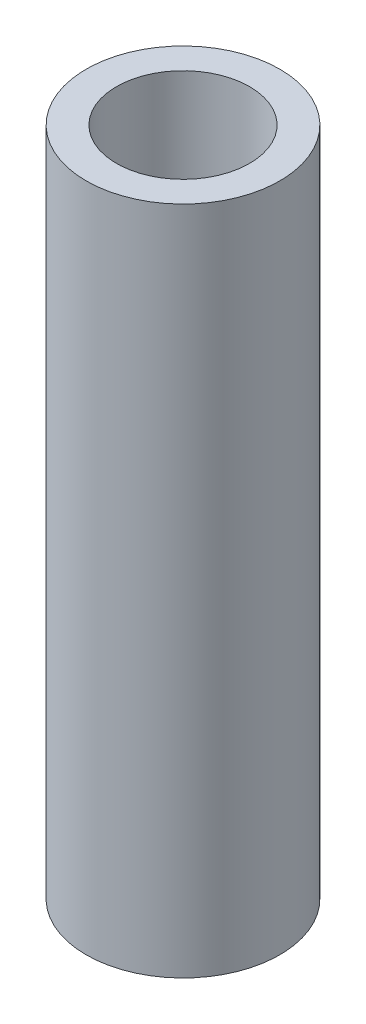
ISO-10303-21;
HEADER;
FILE_DESCRIPTION(('STEP AP214'),'2;1');
FILE_NAME('part.step','',(''),(''),'','','');
FILE_SCHEMA(('AUTOMOTIVE_DESIGN { 1 0 10303 214 1 1 1 1 }'));
ENDSEC;
DATA;
#1=APPLICATION_CONTEXT('core data for automotive mechanical design processes');
#2=APPLICATION_PROTOCOL_DEFINITION('international standard','automotive_design',2000,#1);
#3=PRODUCT_CONTEXT('',#1,'mechanical');
#4=PRODUCT('Part','Part','',(#3));
#5=PRODUCT_RELATED_PRODUCT_CATEGORY('part','',(#4));
#6=PRODUCT_DEFINITION_FORMATION('','',#4);
#7=PRODUCT_DEFINITION_CONTEXT('part definition',#1,'design');
#8=PRODUCT_DEFINITION('design','',#6,#7);
#9=PRODUCT_DEFINITION_SHAPE('','',#8);
#10=(LENGTH_UNIT() NAMED_UNIT(*) SI_UNIT(.MILLI.,.METRE.));
#11=(NAMED_UNIT(*) PLANE_ANGLE_UNIT() SI_UNIT($,.RADIAN.));
#12=(NAMED_UNIT(*) SI_UNIT($,.STERADIAN.) SOLID_ANGLE_UNIT());
#13=UNCERTAINTY_MEASURE_WITH_UNIT(LENGTH_MEASURE(1.E-05),#10,'distance_accuracy_value','');
#14=(GEOMETRIC_REPRESENTATION_CONTEXT(3) GLOBAL_UNCERTAINTY_ASSIGNED_CONTEXT((#13)) GLOBAL_UNIT_ASSIGNED_CONTEXT((#10,
#11,#12)) REPRESENTATION_CONTEXT('',''));
#15=CARTESIAN_POINT('',(0.,0.,0.));
#16=DIRECTION('',(0.,0.,1.));
#17=DIRECTION('',(1.,0.,0.));
#18=AXIS2_PLACEMENT_3D('',#15,#16,#17);
#19=CARTESIAN_POINT('',(0.,45.,0.));
#20=DIRECTION('',(0.,1.,0.));
#21=DIRECTION('',(0.,0.,1.));
#22=AXIS2_PLACEMENT_3D('',#19,#20,#21);
#23=PLANE('',#22);
#24=CARTESIAN_POINT('',(0.,45.,0.));
#25=DIRECTION('',(0.,1.,0.));
#26=DIRECTION('',(0.,0.,1.));
#27=AXIS2_PLACEMENT_3D('',#24,#25,#26);
#28=CIRCLE('',#27,6.5);
#29=CARTESIAN_POINT('',(0.,45.,-6.5));
#30=VERTEX_POINT('',#29);
#31=EDGE_CURVE('E10',#30,#30,#28,.T.);
#32=ORIENTED_EDGE('',*,*,#31,.T.);
#33=EDGE_LOOP('',(#32));
#34=FACE_BOUND('',#33,.T.);
#35=CARTESIAN_POINT('',(0.,45.,0.));
#36=DIRECTION('',(0.,1.,0.));
#37=DIRECTION('',(0.,0.,1.));
#38=AXIS2_PLACEMENT_3D('',#35,#36,#37);
#39=CIRCLE('',#38,4.468);
#40=CARTESIAN_POINT('',(0.,45.,-4.468));
#41=VERTEX_POINT('',#40);
#42=EDGE_CURVE('E50',#41,#41,#39,.T.);
#43=ORIENTED_EDGE('',*,*,#42,.F.);
#44=EDGE_LOOP('',(#43));
#45=FACE_BOUND('',#44,.T.);
#46=ADVANCED_FACE('F39',(#34,#45),#23,.T.);
#47=CARTESIAN_POINT('',(0.,0.,0.));
#48=DIRECTION('',(0.,1.,0.));
#49=DIRECTION('',(0.,0.,1.));
#50=AXIS2_PLACEMENT_3D('',#47,#48,#49);
#51=PLANE('',#50);
#52=CARTESIAN_POINT('',(0.,0.,0.));
#53=DIRECTION('',(0.,1.,0.));
#54=DIRECTION('',(0.,0.,1.));
#55=AXIS2_PLACEMENT_3D('',#52,#53,#54);
#56=CIRCLE('',#55,6.5);
#57=CARTESIAN_POINT('',(0.,0.,-6.5));
#58=VERTEX_POINT('',#57);
#59=EDGE_CURVE('E43',#58,#58,#56,.T.);
#60=ORIENTED_EDGE('',*,*,#59,.F.);
#61=EDGE_LOOP('',(#60));
#62=FACE_BOUND('',#61,.T.);
#63=CARTESIAN_POINT('',(0.,0.,0.));
#64=DIRECTION('',(0.,1.,0.));
#65=DIRECTION('',(0.,0.,1.));
#66=AXIS2_PLACEMENT_3D('',#63,#64,#65);
#67=CIRCLE('',#66,4.468);
#68=CARTESIAN_POINT('',(0.,0.,-4.468));
#69=VERTEX_POINT('',#68);
#70=EDGE_CURVE('E52',#69,#69,#67,.T.);
#71=ORIENTED_EDGE('',*,*,#70,.T.);
#72=EDGE_LOOP('',(#71));
#73=FACE_BOUND('',#72,.T.);
#74=ADVANCED_FACE('F62',(#62,#73),#51,.F.);
#75=CARTESIAN_POINT('',(0.,45.,0.));
#76=DIRECTION('',(0.,-1.,0.));
#77=DIRECTION('',(0.,0.,-1.));
#78=AXIS2_PLACEMENT_3D('',#75,#76,#77);
#79=CYLINDRICAL_SURFACE('',#78,6.5);
#80=CARTESIAN_POINT('',(0.,45.,-6.5));
#81=CARTESIAN_POINT('',(0.,44.53125,-6.5));
#82=CARTESIAN_POINT('',(0.,44.0625,-6.5));
#83=CARTESIAN_POINT('',(0.,43.125,-6.5));
#84=CARTESIAN_POINT('',(0.,42.65625,-6.5));
#85=CARTESIAN_POINT('',(0.,41.71875,-6.5));
#86=CARTESIAN_POINT('',(0.,41.25,-6.5));
#87=CARTESIAN_POINT('',(0.,40.3125,-6.5));
#88=CARTESIAN_POINT('',(0.,39.84375,-6.5));
#89=CARTESIAN_POINT('',(0.,38.90625,-6.5));
#90=CARTESIAN_POINT('',(0.,38.4375,-6.5));
#91=CARTESIAN_POINT('',(0.,37.5,-6.5));
#92=CARTESIAN_POINT('',(0.,37.03125,-6.5));
#93=CARTESIAN_POINT('',(0.,36.09375,-6.5));
#94=CARTESIAN_POINT('',(0.,35.625,-6.5));
#95=CARTESIAN_POINT('',(0.,34.6875,-6.5));
#96=CARTESIAN_POINT('',(0.,34.21875,-6.5));
#97=CARTESIAN_POINT('',(0.,33.28125,-6.5));
#98=CARTESIAN_POINT('',(0.,32.8125,-6.5));
#99=CARTESIAN_POINT('',(0.,31.875,-6.5));
#100=CARTESIAN_POINT('',(0.,31.40625,-6.5));
#101=CARTESIAN_POINT('',(0.,30.46875,-6.5));
#102=CARTESIAN_POINT('',(0.,30.,-6.5));
#103=CARTESIAN_POINT('',(0.,29.0625,-6.5));
#104=CARTESIAN_POINT('',(0.,28.59375,-6.5));
#105=CARTESIAN_POINT('',(0.,27.65625,-6.5));
#106=CARTESIAN_POINT('',(0.,27.1875,-6.5));
#107=CARTESIAN_POINT('',(0.,26.25,-6.5));
#108=CARTESIAN_POINT('',(0.,25.78125,-6.5));
#109=CARTESIAN_POINT('',(0.,24.84375,-6.5));
#110=CARTESIAN_POINT('',(0.,24.375,-6.5));
#111=CARTESIAN_POINT('',(0.,23.4375,-6.5));
#112=CARTESIAN_POINT('',(0.,22.96875,-6.5));
#113=CARTESIAN_POINT('',(0.,22.03125,-6.5));
#114=CARTESIAN_POINT('',(0.,21.5625,-6.5));
#115=CARTESIAN_POINT('',(0.,20.625,-6.5));
#116=CARTESIAN_POINT('',(0.,20.15625,-6.5));
#117=CARTESIAN_POINT('',(0.,19.21875,-6.5));
#118=CARTESIAN_POINT('',(0.,18.75,-6.5));
#119=CARTESIAN_POINT('',(0.,17.8125,-6.5));
#120=CARTESIAN_POINT('',(0.,17.34375,-6.5));
#121=CARTESIAN_POINT('',(0.,16.40625,-6.5));
#122=CARTESIAN_POINT('',(0.,15.9375,-6.5));
#123=CARTESIAN_POINT('',(0.,15.,-6.5));
#124=CARTESIAN_POINT('',(0.,14.53125,-6.5));
#125=CARTESIAN_POINT('',(0.,13.59375,-6.5));
#126=CARTESIAN_POINT('',(0.,13.125,-6.5));
#127=CARTESIAN_POINT('',(0.,12.1875,-6.5));
#128=CARTESIAN_POINT('',(0.,11.71875,-6.5));
#129=CARTESIAN_POINT('',(0.,10.78125,-6.5));
#130=CARTESIAN_POINT('',(0.,10.3125,-6.5));
#131=CARTESIAN_POINT('',(0.,9.37499999999999,-6.5));
#132=CARTESIAN_POINT('',(0.,8.90624999999999,-6.5));
#133=CARTESIAN_POINT('',(0.,7.96874999999999,-6.5));
#134=CARTESIAN_POINT('',(0.,7.5,-6.5));
#135=CARTESIAN_POINT('',(0.,6.56249999999999,-6.5));
#136=CARTESIAN_POINT('',(0.,6.09374999999999,-6.5));
#137=CARTESIAN_POINT('',(0.,5.15624999999999,-6.5));
#138=CARTESIAN_POINT('',(0.,4.68749999999999,-6.5));
#139=CARTESIAN_POINT('',(0.,3.74999999999999,-6.5));
#140=CARTESIAN_POINT('',(0.,3.28124999999999,-6.5));
#141=CARTESIAN_POINT('',(0.,2.34374999999999,-6.5));
#142=CARTESIAN_POINT('',(0.,1.87499999999999,-6.5));
#143=CARTESIAN_POINT('',(0.,0.937499999999992,-6.5));
#144=CARTESIAN_POINT('',(0.,0.468749999999993,-6.5));
#145=CARTESIAN_POINT('',(0.,0.,-6.5));
#146=B_SPLINE_CURVE_WITH_KNOTS('',3,(#80,#81,#82,#83,#84,#85,#86,#87,#88,#89,#90,#91,#92,#93,
#94,#95,#96,#97,#98,#99,#100,#101,#102,#103,#104,#105,#106,#107,#108,#109,#110,#111,#112,#113,
#114,#115,#116,#117,#118,#119,#120,#121,#122,#123,#124,#125,#126,#127,#128,#129,#130,#131,#132,
#133,#134,#135,#136,#137,#138,#139,#140,#141,#142,#143,#144,#145),.UNSPECIFIED.,.F.,.F.,(4,2,2,
2,2,2,2,2,2,2,2,2,2,2,2,2,2,2,2,2,2,2,2,2,2,2,2,2,2,2,2,2,4),(0.,1.40625,2.8125,
4.21874999999999,5.625,7.03125,8.43749999999999,9.84375,11.25,12.65625,14.0625,15.46875,16.875,
18.28125,19.6875,21.09375,22.5,23.90625,25.3125,26.71875,28.125,29.53125,30.9375,32.34375,33.75,
35.15625,36.5625,37.96875,39.375,40.78125,42.1875,43.59375,45.),.UNSPECIFIED.);
#147=EDGE_CURVE('BSEAM41',#30,#58,#146,.T.);
#148=ORIENTED_EDGE('',*,*,#31,.F.);
#149=ORIENTED_EDGE('',*,*,#59,.T.);
#150=ORIENTED_EDGE('',*,*,#147,.T.);
#151=ORIENTED_EDGE('',*,*,#147,.F.);
#152=EDGE_LOOP('',(#148,#150,#149,#151));
#153=FACE_BOUND('',#152,.T.);
#154=ADVANCED_FACE('F41',(#153),#79,.T.);
#155=CARTESIAN_POINT('',(0.,45.,0.));
#156=DIRECTION('',(0.,-1.,0.));
#157=DIRECTION('',(0.,0.,-1.));
#158=AXIS2_PLACEMENT_3D('',#155,#156,#157);
#159=CYLINDRICAL_SURFACE('',#158,4.468);
#160=CARTESIAN_POINT('',(0.,45.,-4.468));
#161=CARTESIAN_POINT('',(0.,44.53125,-4.468));
#162=CARTESIAN_POINT('',(0.,44.0625,-4.468));
#163=CARTESIAN_POINT('',(0.,43.125,-4.468));
#164=CARTESIAN_POINT('',(0.,42.65625,-4.468));
#165=CARTESIAN_POINT('',(0.,41.71875,-4.468));
#166=CARTESIAN_POINT('',(0.,41.25,-4.468));
#167=CARTESIAN_POINT('',(0.,40.3125,-4.468));
#168=CARTESIAN_POINT('',(0.,39.84375,-4.468));
#169=CARTESIAN_POINT('',(0.,38.90625,-4.468));
#170=CARTESIAN_POINT('',(0.,38.4375,-4.468));
#171=CARTESIAN_POINT('',(0.,37.5,-4.468));
#172=CARTESIAN_POINT('',(0.,37.03125,-4.468));
#173=CARTESIAN_POINT('',(0.,36.09375,-4.468));
#174=CARTESIAN_POINT('',(0.,35.625,-4.468));
#175=CARTESIAN_POINT('',(0.,34.6875,-4.468));
#176=CARTESIAN_POINT('',(0.,34.21875,-4.468));
#177=CARTESIAN_POINT('',(0.,33.28125,-4.468));
#178=CARTESIAN_POINT('',(0.,32.8125,-4.468));
#179=CARTESIAN_POINT('',(0.,31.875,-4.468));
#180=CARTESIAN_POINT('',(0.,31.40625,-4.468));
#181=CARTESIAN_POINT('',(0.,30.46875,-4.468));
#182=CARTESIAN_POINT('',(0.,30.,-4.468));
#183=CARTESIAN_POINT('',(0.,29.0625,-4.468));
#184=CARTESIAN_POINT('',(0.,28.59375,-4.468));
#185=CARTESIAN_POINT('',(0.,27.65625,-4.468));
#186=CARTESIAN_POINT('',(0.,27.1875,-4.468));
#187=CARTESIAN_POINT('',(0.,26.25,-4.468));
#188=CARTESIAN_POINT('',(0.,25.78125,-4.468));
#189=CARTESIAN_POINT('',(0.,24.84375,-4.468));
#190=CARTESIAN_POINT('',(0.,24.375,-4.468));
#191=CARTESIAN_POINT('',(0.,23.4375,-4.468));
#192=CARTESIAN_POINT('',(0.,22.96875,-4.468));
#193=CARTESIAN_POINT('',(0.,22.03125,-4.468));
#194=CARTESIAN_POINT('',(0.,21.5625,-4.468));
#195=CARTESIAN_POINT('',(0.,20.625,-4.468));
#196=CARTESIAN_POINT('',(0.,20.15625,-4.468));
#197=CARTESIAN_POINT('',(0.,19.21875,-4.468));
#198=CARTESIAN_POINT('',(0.,18.75,-4.468));
#199=CARTESIAN_POINT('',(0.,17.8125,-4.468));
#200=CARTESIAN_POINT('',(0.,17.34375,-4.468));
#201=CARTESIAN_POINT('',(0.,16.40625,-4.468));
#202=CARTESIAN_POINT('',(0.,15.9375,-4.468));
#203=CARTESIAN_POINT('',(0.,15.,-4.468));
#204=CARTESIAN_POINT('',(0.,14.53125,-4.468));
#205=CARTESIAN_POINT('',(0.,13.59375,-4.468));
#206=CARTESIAN_POINT('',(0.,13.125,-4.468));
#207=CARTESIAN_POINT('',(0.,12.1875,-4.468));
#208=CARTESIAN_POINT('',(0.,11.71875,-4.468));
#209=CARTESIAN_POINT('',(0.,10.78125,-4.468));
#210=CARTESIAN_POINT('',(0.,10.3125,-4.468));
#211=CARTESIAN_POINT('',(0.,9.375,-4.468));
#212=CARTESIAN_POINT('',(0.,8.90625,-4.468));
#213=CARTESIAN_POINT('',(0.,7.96874999999999,-4.468));
#214=CARTESIAN_POINT('',(0.,7.5,-4.468));
#215=CARTESIAN_POINT('',(0.,6.5625,-4.468));
#216=CARTESIAN_POINT('',(0.,6.09375,-4.468));
#217=CARTESIAN_POINT('',(0.,5.15625,-4.468));
#218=CARTESIAN_POINT('',(0.,4.68749999999999,-4.468));
#219=CARTESIAN_POINT('',(0.,3.74999999999999,-4.468));
#220=CARTESIAN_POINT('',(0.,3.28124999999999,-4.468));
#221=CARTESIAN_POINT('',(0.,2.34374999999999,-4.468));
#222=CARTESIAN_POINT('',(0.,1.87499999999999,-4.468));
#223=CARTESIAN_POINT('',(0.,0.937499999999992,-4.468));
#224=CARTESIAN_POINT('',(0.,0.468749999999993,-4.468));
#225=CARTESIAN_POINT('',(0.,0.,-4.468));
#226=B_SPLINE_CURVE_WITH_KNOTS('',3,(#160,#161,#162,#163,#164,#165,#166,#167,#168,#169,#170,
#171,#172,#173,#174,#175,#176,#177,#178,#179,#180,#181,#182,#183,#184,#185,#186,#187,#188,#189,
#190,#191,#192,#193,#194,#195,#196,#197,#198,#199,#200,#201,#202,#203,#204,#205,#206,#207,#208,
#209,#210,#211,#212,#213,#214,#215,#216,#217,#218,#219,#220,#221,#222,#223,#224,#225),
.UNSPECIFIED.,.F.,.F.,(4,2,2,2,2,2,2,2,2,2,2,2,2,2,2,2,2,2,2,2,2,2,2,2,2,2,2,2,2,2,2,2,4),(0.,
1.40625,2.8125,4.21875000000001,5.62500000000001,7.03125,8.4375,9.84375000000001,11.25,12.65625,
14.0625,15.46875,16.875,18.28125,19.6875,21.09375,22.5,23.90625,25.3125,26.71875,28.125,
29.53125,30.9375,32.34375,33.75,35.15625,36.5625,37.96875,39.375,40.78125,42.1875,43.59375,45.),.UNSPECIFIED.);
#227=EDGE_CURVE('BSEAM58',#41,#69,#226,.T.);
#228=ORIENTED_EDGE('',*,*,#42,.T.);
#229=ORIENTED_EDGE('',*,*,#70,.F.);
#230=ORIENTED_EDGE('',*,*,#227,.T.);
#231=ORIENTED_EDGE('',*,*,#227,.F.);
#232=EDGE_LOOP('',(#228,#230,#229,#231));
#233=FACE_BOUND('',#232,.T.);
#234=ADVANCED_FACE('F58',(#233),#159,.F.);
#235=CLOSED_SHELL('',(#46,#74,#154,#234));
#236=MANIFOLD_SOLID_BREP('B2',#235);
#237=ADVANCED_BREP_SHAPE_REPRESENTATION('',(#18,#236),#14);
#238=SHAPE_DEFINITION_REPRESENTATION(#9,#237);
ENDSEC;
END-ISO-10303-21;
